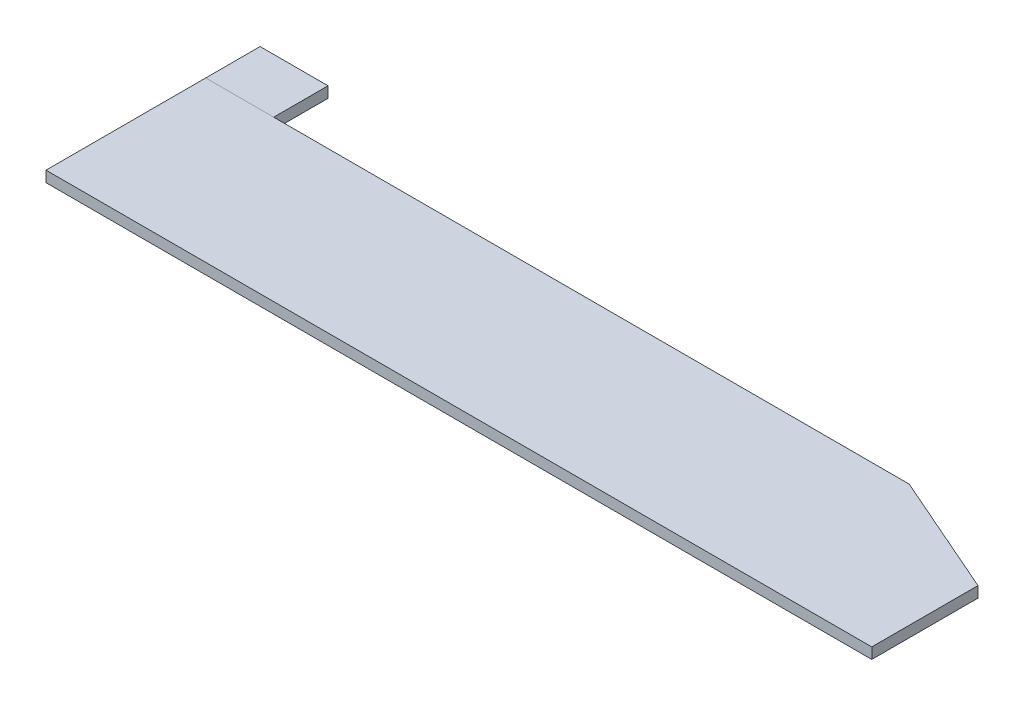
ISO-10303-21;
HEADER;
FILE_DESCRIPTION(('STEP AP214'),'2;1');
FILE_NAME('part.step','',(''),(''),'','','');
FILE_SCHEMA(('AUTOMOTIVE_DESIGN { 1 0 10303 214 1 1 1 1 }'));
ENDSEC;
DATA;
#1=APPLICATION_CONTEXT('core data for automotive mechanical design processes');
#2=APPLICATION_PROTOCOL_DEFINITION('international standard','automotive_design',2000,#1);
#3=PRODUCT_CONTEXT('',#1,'mechanical');
#4=PRODUCT('Part','Part','',(#3));
#5=PRODUCT_RELATED_PRODUCT_CATEGORY('part','',(#4));
#6=PRODUCT_DEFINITION_FORMATION('','',#4);
#7=PRODUCT_DEFINITION_CONTEXT('part definition',#1,'design');
#8=PRODUCT_DEFINITION('design','',#6,#7);
#9=PRODUCT_DEFINITION_SHAPE('','',#8);
#10=(LENGTH_UNIT() NAMED_UNIT(*) SI_UNIT(.MILLI.,.METRE.));
#11=(NAMED_UNIT(*) PLANE_ANGLE_UNIT() SI_UNIT($,.RADIAN.));
#12=(NAMED_UNIT(*) SI_UNIT($,.STERADIAN.) SOLID_ANGLE_UNIT());
#13=UNCERTAINTY_MEASURE_WITH_UNIT(LENGTH_MEASURE(1.E-05),#10,'distance_accuracy_value','');
#14=(GEOMETRIC_REPRESENTATION_CONTEXT(3) GLOBAL_UNCERTAINTY_ASSIGNED_CONTEXT((#13)) GLOBAL_UNIT_ASSIGNED_CONTEXT((#10,
#11,#12)) REPRESENTATION_CONTEXT('',''));
#15=CARTESIAN_POINT('',(0.,0.,0.));
#16=DIRECTION('',(0.,0.,1.));
#17=DIRECTION('',(1.,0.,0.));
#18=AXIS2_PLACEMENT_3D('',#15,#16,#17);
#19=CARTESIAN_POINT('',(-43.4424489795918,0.,-9.16795918367346));
#20=DIRECTION('',(-1.,0.,0.));
#21=DIRECTION('',(0.,0.,1.));
#22=AXIS2_PLACEMENT_3D('',#19,#20,#21);
#23=PLANE('',#22);
#24=DIRECTION('',(0.,0.,1.));
#25=VECTOR('',#24,1.);
#26=CARTESIAN_POINT('',(-43.4424489795918,1.6,-9.16795918367346));
#27=LINE('',#26,#25);
#28=CARTESIAN_POINT('',(-43.4424489795918,1.6,-17.1679591836735));
#29=VERTEX_POINT('',#28);
#30=CARTESIAN_POINT('',(-43.4424489795918,1.6,-9.16795918367346));
#31=VERTEX_POINT('',#30);
#32=EDGE_CURVE('E109',#29,#31,#27,.T.);
#33=ORIENTED_EDGE('',*,*,#32,.F.);
#34=DIRECTION('',(0.,1.,0.));
#35=VECTOR('',#34,1.);
#36=CARTESIAN_POINT('',(-43.4424489795918,0.,-17.1679591836735));
#37=LINE('',#36,#35);
#38=CARTESIAN_POINT('',(-43.4424489795918,0.,-17.1679591836735));
#39=VERTEX_POINT('',#38);
#40=EDGE_CURVE('E12',#39,#29,#37,.T.);
#41=ORIENTED_EDGE('',*,*,#40,.F.);
#42=DIRECTION('',(0.,0.,1.));
#43=VECTOR('',#42,1.);
#44=CARTESIAN_POINT('',(-43.4424489795918,0.,-9.16795918367346));
#45=LINE('',#44,#43);
#46=CARTESIAN_POINT('',(-43.4424489795918,0.,-9.16795918367346));
#47=VERTEX_POINT('',#46);
#48=EDGE_CURVE('E103',#39,#47,#45,.T.);
#49=ORIENTED_EDGE('',*,*,#48,.T.);
#50=DIRECTION('',(0.,1.,0.));
#51=VECTOR('',#50,1.);
#52=CARTESIAN_POINT('',(-43.4424489795918,0.,-9.16795918367346));
#53=LINE('',#52,#51);
#54=EDGE_CURVE('E48',#47,#31,#53,.T.);
#55=ORIENTED_EDGE('',*,*,#54,.T.);
#56=EDGE_LOOP('',(#33,#41,#49,#55));
#57=FACE_BOUND('',#56,.T.);
#58=ADVANCED_FACE('F45',(#57),#23,.T.);
#59=CARTESIAN_POINT('',(-43.4424489795918,0.,-17.1679591836735));
#60=DIRECTION('',(0.,0.,-1.));
#61=DIRECTION('',(-1.,0.,0.));
#62=AXIS2_PLACEMENT_3D('',#59,#60,#61);
#63=PLANE('',#62);
#64=DIRECTION('',(-1.,0.,0.));
#65=VECTOR('',#64,1.);
#66=CARTESIAN_POINT('',(-43.4424489795918,1.6,-17.1679591836735));
#67=LINE('',#66,#65);
#68=CARTESIAN_POINT('',(-33.4424489795918,1.6,-17.1679591836735));
#69=VERTEX_POINT('',#68);
#70=EDGE_CURVE('E105',#69,#29,#67,.T.);
#71=ORIENTED_EDGE('',*,*,#70,.F.);
#72=DIRECTION('',(0.,1.,0.));
#73=VECTOR('',#72,1.);
#74=CARTESIAN_POINT('',(-33.4424489795918,0.,-17.1679591836735));
#75=LINE('',#74,#73);
#76=CARTESIAN_POINT('',(-33.4424489795918,0.,-17.1679591836735));
#77=VERTEX_POINT('',#76);
#78=EDGE_CURVE('E54',#77,#69,#75,.T.);
#79=ORIENTED_EDGE('',*,*,#78,.F.);
#80=DIRECTION('',(-1.,0.,0.));
#81=VECTOR('',#80,1.);
#82=CARTESIAN_POINT('',(-43.4424489795918,0.,-17.1679591836735));
#83=LINE('',#82,#81);
#84=EDGE_CURVE('E100',#77,#39,#83,.T.);
#85=ORIENTED_EDGE('',*,*,#84,.T.);
#86=ORIENTED_EDGE('',*,*,#40,.T.);
#87=EDGE_LOOP('',(#71,#79,#85,#86));
#88=FACE_BOUND('',#87,.T.);
#89=ADVANCED_FACE('F119',(#88),#63,.T.);
#90=CARTESIAN_POINT('',(-33.4424489795918,0.,-9.16795918367346));
#91=DIRECTION('',(1.,0.,0.));
#92=DIRECTION('',(0.,0.,-1.));
#93=AXIS2_PLACEMENT_3D('',#90,#91,#92);
#94=PLANE('',#93);
#95=DIRECTION('',(0.,0.,-1.));
#96=VECTOR('',#95,1.);
#97=CARTESIAN_POINT('',(-33.4424489795918,1.6,-9.16795918367346));
#98=LINE('',#97,#96);
#99=CARTESIAN_POINT('',(-33.4424489795918,1.6,-9.16795918367346));
#100=VERTEX_POINT('',#99);
#101=EDGE_CURVE('E95',#100,#69,#98,.T.);
#102=ORIENTED_EDGE('',*,*,#101,.F.);
#103=DIRECTION('',(0.,1.,0.));
#104=VECTOR('',#103,1.);
#105=CARTESIAN_POINT('',(-33.4424489795918,0.,-9.16795918367346));
#106=LINE('',#105,#104);
#107=CARTESIAN_POINT('',(-33.4424489795918,0.,-9.16795918367346));
#108=VERTEX_POINT('',#107);
#109=EDGE_CURVE('E90',#108,#100,#106,.T.);
#110=ORIENTED_EDGE('',*,*,#109,.F.);
#111=DIRECTION('',(0.,0.,-1.));
#112=VECTOR('',#111,1.);
#113=CARTESIAN_POINT('',(-33.4424489795918,0.,-9.16795918367346));
#114=LINE('',#113,#112);
#115=EDGE_CURVE('E93',#108,#77,#114,.T.);
#116=ORIENTED_EDGE('',*,*,#115,.T.);
#117=ORIENTED_EDGE('',*,*,#78,.T.);
#118=EDGE_LOOP('',(#102,#110,#116,#117));
#119=FACE_BOUND('',#118,.T.);
#120=ADVANCED_FACE('F92',(#119),#94,.T.);
#121=CARTESIAN_POINT('',(-43.4424489795918,0.,-9.16795918367346));
#122=DIRECTION('',(0.,0.,1.));
#123=DIRECTION('',(1.,0.,0.));
#124=AXIS2_PLACEMENT_3D('',#121,#122,#123);
#125=PLANE('',#124);
#126=DIRECTION('',(1.,0.,0.));
#127=VECTOR('',#126,1.);
#128=CARTESIAN_POINT('',(-43.4424489795918,1.6,-9.16795918367346));
#129=LINE('',#128,#127);
#130=EDGE_CURVE('E112',#31,#100,#129,.T.);
#131=ORIENTED_EDGE('',*,*,#130,.F.);
#132=ORIENTED_EDGE('',*,*,#54,.F.);
#133=DIRECTION('',(1.,0.,0.));
#134=VECTOR('',#133,1.);
#135=CARTESIAN_POINT('',(-43.4424489795918,0.,-9.16795918367346));
#136=LINE('',#135,#134);
#137=EDGE_CURVE('E99',#47,#108,#136,.T.);
#138=ORIENTED_EDGE('',*,*,#137,.T.);
#139=ORIENTED_EDGE('',*,*,#109,.T.);
#140=EDGE_LOOP('',(#131,#132,#138,#139));
#141=FACE_BOUND('',#140,.T.);
#142=ADVANCED_FACE('F102',(#141),#125,.T.);
#143=CARTESIAN_POINT('',(0.,0.,0.));
#144=DIRECTION('',(0.,-1.,0.));
#145=DIRECTION('',(0.,0.,-1.));
#146=AXIS2_PLACEMENT_3D('',#143,#144,#145);
#147=PLANE('',#146);
#148=ORIENTED_EDGE('',*,*,#48,.F.);
#149=ORIENTED_EDGE('',*,*,#84,.F.);
#150=ORIENTED_EDGE('',*,*,#115,.F.);
#151=ORIENTED_EDGE('',*,*,#137,.F.);
#152=EDGE_LOOP('',(#148,#149,#150,#151));
#153=FACE_BOUND('',#152,.T.);
#154=ADVANCED_FACE('F98',(#153),#147,.T.);
#155=CARTESIAN_POINT('',(0.,1.6,0.));
#156=DIRECTION('',(0.,-1.,0.));
#157=DIRECTION('',(0.,0.,-1.));
#158=AXIS2_PLACEMENT_3D('',#155,#156,#157);
#159=PLANE('',#158);
#160=ORIENTED_EDGE('',*,*,#32,.T.);
#161=ORIENTED_EDGE('',*,*,#130,.T.);
#162=ORIENTED_EDGE('',*,*,#101,.T.);
#163=ORIENTED_EDGE('',*,*,#70,.T.);
#164=EDGE_LOOP('',(#160,#161,#162,#163));
#165=FACE_BOUND('',#164,.T.);
#166=ADVANCED_FACE('F118',(#165),#159,.F.);
#167=CLOSED_SHELL('',(#58,#89,#120,#142,#154,#166));
#168=MANIFOLD_SOLID_BREP('B2',#167);
#169=CARTESIAN_POINT('',(-43.4424489795918,1.6,14.3320408163265));
#170=DIRECTION('',(0.,0.,-1.));
#171=DIRECTION('',(-1.,0.,0.));
#172=AXIS2_PLACEMENT_3D('',#169,#170,#171);
#173=PLANE('',#172);
#174=DIRECTION('',(1.,0.,0.));
#175=VECTOR('',#174,1.);
#176=CARTESIAN_POINT('',(-43.4424489795918,0.,14.3320408163265));
#177=LINE('',#176,#175);
#178=CARTESIAN_POINT('',(-43.4424489795918,0.,14.3320408163265));
#179=VERTEX_POINT('',#178);
#180=CARTESIAN_POINT('',(78.0575510204082,0.,14.3320408163265));
#181=VERTEX_POINT('',#180);
#182=EDGE_CURVE('E246',#179,#181,#177,.T.);
#183=ORIENTED_EDGE('',*,*,#182,.T.);
#184=DIRECTION('',(0.,-1.,0.));
#185=VECTOR('',#184,1.);
#186=CARTESIAN_POINT('',(78.0575510204082,1.6,14.3320408163265));
#187=LINE('',#186,#185);
#188=CARTESIAN_POINT('',(78.0575510204082,1.6,14.3320408163265));
#189=VERTEX_POINT('',#188);
#190=EDGE_CURVE('E43',#189,#181,#187,.T.);
#191=ORIENTED_EDGE('',*,*,#190,.F.);
#192=DIRECTION('',(1.,0.,0.));
#193=VECTOR('',#192,1.);
#194=CARTESIAN_POINT('',(-43.4424489795918,1.6,14.3320408163265));
#195=LINE('',#194,#193);
#196=CARTESIAN_POINT('',(-43.4424489795918,1.6,14.3320408163265));
#197=VERTEX_POINT('',#196);
#198=EDGE_CURVE('E254',#197,#189,#195,.T.);
#199=ORIENTED_EDGE('',*,*,#198,.F.);
#200=DIRECTION('',(0.,-1.,0.));
#201=VECTOR('',#200,1.);
#202=CARTESIAN_POINT('',(-43.4424489795918,1.6,14.3320408163265));
#203=LINE('',#202,#201);
#204=EDGE_CURVE('E242',#197,#179,#203,.T.);
#205=ORIENTED_EDGE('',*,*,#204,.T.);
#206=EDGE_LOOP('',(#183,#191,#199,#205));
#207=FACE_BOUND('',#206,.T.);
#208=ADVANCED_FACE('F172',(#207),#173,.F.);
#209=CARTESIAN_POINT('',(78.0575510204082,1.6,14.3320408163265));
#210=DIRECTION('',(-1.,0.,0.));
#211=DIRECTION('',(0.,0.,1.));
#212=AXIS2_PLACEMENT_3D('',#209,#210,#211);
#213=PLANE('',#212);
#214=DIRECTION('',(0.,0.,-1.));
#215=VECTOR('',#214,1.);
#216=CARTESIAN_POINT('',(78.0575510204082,0.,14.3320408163265));
#217=LINE('',#216,#215);
#218=CARTESIAN_POINT('',(78.0575510204082,0.,-1.29795918367346));
#219=VERTEX_POINT('',#218);
#220=EDGE_CURVE('E249',#181,#219,#217,.T.);
#221=ORIENTED_EDGE('',*,*,#220,.T.);
#222=DIRECTION('',(0.,-1.,0.));
#223=VECTOR('',#222,1.);
#224=CARTESIAN_POINT('',(78.0575510204082,1.6,-1.29795918367346));
#225=LINE('',#224,#223);
#226=CARTESIAN_POINT('',(78.0575510204082,1.6,-1.29795918367346));
#227=VERTEX_POINT('',#226);
#228=EDGE_CURVE('E180',#227,#219,#225,.T.);
#229=ORIENTED_EDGE('',*,*,#228,.F.);
#230=DIRECTION('',(0.,0.,-1.));
#231=VECTOR('',#230,1.);
#232=CARTESIAN_POINT('',(78.0575510204082,1.6,14.3320408163265));
#233=LINE('',#232,#231);
#234=EDGE_CURVE('E222',#189,#227,#233,.T.);
#235=ORIENTED_EDGE('',*,*,#234,.F.);
#236=ORIENTED_EDGE('',*,*,#190,.T.);
#237=EDGE_LOOP('',(#221,#229,#235,#236));
#238=FACE_BOUND('',#237,.T.);
#239=ADVANCED_FACE('F273',(#238),#213,.F.);
#240=CARTESIAN_POINT('',(60.0575510204082,1.6,-9.16795918367347));
#241=DIRECTION('',(-0.400605198171283,0.,0.916250770912717));
#242=DIRECTION('',(0.916250770912717,0.,0.400605198171283));
#243=AXIS2_PLACEMENT_3D('',#240,#241,#242);
#244=PLANE('',#243);
#245=DIRECTION('',(-0.916250770912717,0.,-0.400605198171283));
#246=VECTOR('',#245,1.);
#247=CARTESIAN_POINT('',(60.0575510204082,0.,-9.16795918367347));
#248=LINE('',#247,#246);
#249=CARTESIAN_POINT('',(60.0575510204082,0.,-9.16795918367347));
#250=VERTEX_POINT('',#249);
#251=EDGE_CURVE('E237',#219,#250,#248,.T.);
#252=ORIENTED_EDGE('',*,*,#251,.T.);
#253=DIRECTION('',(0.,-1.,0.));
#254=VECTOR('',#253,1.);
#255=CARTESIAN_POINT('',(60.0575510204082,1.6,-9.16795918367347));
#256=LINE('',#255,#254);
#257=CARTESIAN_POINT('',(60.0575510204082,1.6,-9.16795918367347));
#258=VERTEX_POINT('',#257);
#259=EDGE_CURVE('E234',#258,#250,#256,.T.);
#260=ORIENTED_EDGE('',*,*,#259,.F.);
#261=DIRECTION('',(-0.916250770912717,0.,-0.400605198171283));
#262=VECTOR('',#261,1.);
#263=CARTESIAN_POINT('',(60.0575510204082,1.6,-9.16795918367347));
#264=LINE('',#263,#262);
#265=EDGE_CURVE('E226',#227,#258,#264,.T.);
#266=ORIENTED_EDGE('',*,*,#265,.F.);
#267=ORIENTED_EDGE('',*,*,#228,.T.);
#268=EDGE_LOOP('',(#252,#260,#266,#267));
#269=FACE_BOUND('',#268,.T.);
#270=ADVANCED_FACE('F235',(#269),#244,.F.);
#271=CARTESIAN_POINT('',(60.0575510204082,1.6,-9.16795918367347));
#272=DIRECTION('',(0.,0.,1.));
#273=DIRECTION('',(1.,0.,0.));
#274=AXIS2_PLACEMENT_3D('',#271,#272,#273);
#275=PLANE('',#274);
#276=DIRECTION('',(-1.,0.,0.));
#277=VECTOR('',#276,1.);
#278=CARTESIAN_POINT('',(60.0575510204082,0.,-9.16795918367347));
#279=LINE('',#278,#277);
#280=CARTESIAN_POINT('',(-43.4424489795918,0.,-9.16795918367346));
#281=VERTEX_POINT('',#280);
#282=EDGE_CURVE('E208',#250,#281,#279,.T.);
#283=ORIENTED_EDGE('',*,*,#282,.T.);
#284=DIRECTION('',(0.,-1.,0.));
#285=VECTOR('',#284,1.);
#286=CARTESIAN_POINT('',(-43.4424489795918,1.6,-9.16795918367346));
#287=LINE('',#286,#285);
#288=CARTESIAN_POINT('',(-43.4424489795918,1.6,-9.16795918367346));
#289=VERTEX_POINT('',#288);
#290=EDGE_CURVE('E238',#289,#281,#287,.T.);
#291=ORIENTED_EDGE('',*,*,#290,.F.);
#292=DIRECTION('',(-1.,0.,0.));
#293=VECTOR('',#292,1.);
#294=CARTESIAN_POINT('',(60.0575510204082,1.6,-9.16795918367347));
#295=LINE('',#294,#293);
#296=EDGE_CURVE('E230',#258,#289,#295,.T.);
#297=ORIENTED_EDGE('',*,*,#296,.F.);
#298=ORIENTED_EDGE('',*,*,#259,.T.);
#299=EDGE_LOOP('',(#283,#291,#297,#298));
#300=FACE_BOUND('',#299,.T.);
#301=ADVANCED_FACE('F240',(#300),#275,.F.);
#302=CARTESIAN_POINT('',(-43.4424489795918,1.6,-9.16795918367346));
#303=DIRECTION('',(1.,0.,0.));
#304=DIRECTION('',(0.,0.,-1.));
#305=AXIS2_PLACEMENT_3D('',#302,#303,#304);
#306=PLANE('',#305);
#307=DIRECTION('',(0.,0.,1.));
#308=VECTOR('',#307,1.);
#309=CARTESIAN_POINT('',(-43.4424489795918,0.,-9.16795918367346));
#310=LINE('',#309,#308);
#311=EDGE_CURVE('E214',#281,#179,#310,.T.);
#312=ORIENTED_EDGE('',*,*,#311,.T.);
#313=ORIENTED_EDGE('',*,*,#204,.F.);
#314=DIRECTION('',(0.,0.,1.));
#315=VECTOR('',#314,1.);
#316=CARTESIAN_POINT('',(-43.4424489795918,1.6,-9.16795918367346));
#317=LINE('',#316,#315);
#318=EDGE_CURVE('E188',#289,#197,#317,.T.);
#319=ORIENTED_EDGE('',*,*,#318,.F.);
#320=ORIENTED_EDGE('',*,*,#290,.T.);
#321=EDGE_LOOP('',(#312,#313,#319,#320));
#322=FACE_BOUND('',#321,.T.);
#323=ADVANCED_FACE('F262',(#322),#306,.F.);
#324=CARTESIAN_POINT('',(0.,1.6,0.));
#325=DIRECTION('',(0.,1.,0.));
#326=DIRECTION('',(0.,0.,1.));
#327=AXIS2_PLACEMENT_3D('',#324,#325,#326);
#328=PLANE('',#327);
#329=ORIENTED_EDGE('',*,*,#198,.T.);
#330=ORIENTED_EDGE('',*,*,#234,.T.);
#331=ORIENTED_EDGE('',*,*,#265,.T.);
#332=ORIENTED_EDGE('',*,*,#296,.T.);
#333=ORIENTED_EDGE('',*,*,#318,.T.);
#334=EDGE_LOOP('',(#329,#330,#331,#332,#333));
#335=FACE_BOUND('',#334,.T.);
#336=ADVANCED_FACE('F228',(#335),#328,.T.);
#337=CARTESIAN_POINT('',(0.,0.,0.));
#338=DIRECTION('',(0.,1.,0.));
#339=DIRECTION('',(0.,0.,1.));
#340=AXIS2_PLACEMENT_3D('',#337,#338,#339);
#341=PLANE('',#340);
#342=ORIENTED_EDGE('',*,*,#182,.F.);
#343=ORIENTED_EDGE('',*,*,#311,.F.);
#344=ORIENTED_EDGE('',*,*,#282,.F.);
#345=ORIENTED_EDGE('',*,*,#251,.F.);
#346=ORIENTED_EDGE('',*,*,#220,.F.);
#347=EDGE_LOOP('',(#342,#343,#344,#345,#346));
#348=FACE_BOUND('',#347,.T.);
#349=ADVANCED_FACE('F258',(#348),#341,.F.);
#350=CLOSED_SHELL('',(#208,#239,#270,#301,#323,#336,#349));
#351=MANIFOLD_SOLID_BREP('B6',#350);
#352=ADVANCED_BREP_SHAPE_REPRESENTATION('',(#18,#168,#351),#14);
#353=SHAPE_DEFINITION_REPRESENTATION(#9,#352);
ENDSEC;
END-ISO-10303-21;
